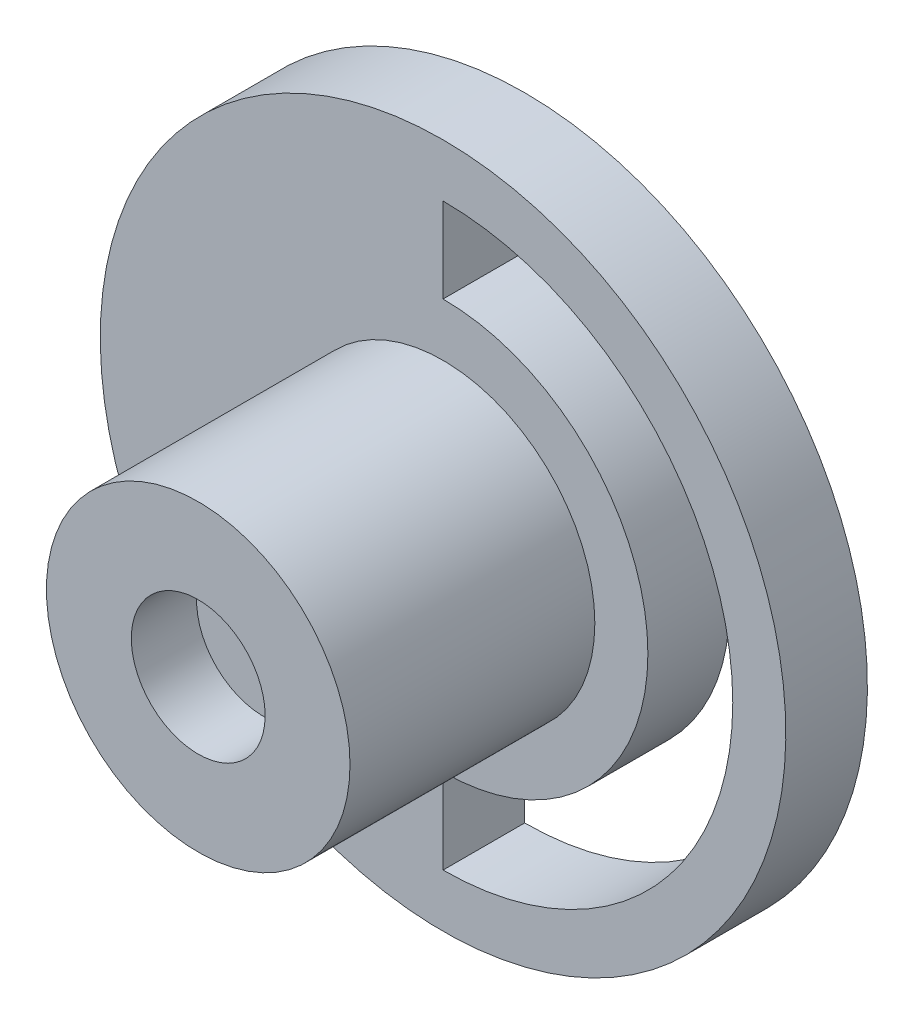
ISO-10303-21;
HEADER;
FILE_DESCRIPTION(('STEP AP214'),'2;1');
FILE_NAME('part.step','',(''),(''),'','','');
FILE_SCHEMA(('AUTOMOTIVE_DESIGN { 1 0 10303 214 1 1 1 1 }'));
ENDSEC;
DATA;
#1=APPLICATION_CONTEXT('core data for automotive mechanical design processes');
#2=APPLICATION_PROTOCOL_DEFINITION('international standard','automotive_design',2000,#1);
#3=PRODUCT_CONTEXT('',#1,'mechanical');
#4=PRODUCT('Part','Part','',(#3));
#5=PRODUCT_RELATED_PRODUCT_CATEGORY('part','',(#4));
#6=PRODUCT_DEFINITION_FORMATION('','',#4);
#7=PRODUCT_DEFINITION_CONTEXT('part definition',#1,'design');
#8=PRODUCT_DEFINITION('design','',#6,#7);
#9=PRODUCT_DEFINITION_SHAPE('','',#8);
#10=(LENGTH_UNIT() NAMED_UNIT(*) SI_UNIT(.MILLI.,.METRE.));
#11=(NAMED_UNIT(*) PLANE_ANGLE_UNIT() SI_UNIT($,.RADIAN.));
#12=(NAMED_UNIT(*) SI_UNIT($,.STERADIAN.) SOLID_ANGLE_UNIT());
#13=UNCERTAINTY_MEASURE_WITH_UNIT(LENGTH_MEASURE(1.E-05),#10,'distance_accuracy_value','');
#14=(GEOMETRIC_REPRESENTATION_CONTEXT(3) GLOBAL_UNCERTAINTY_ASSIGNED_CONTEXT((#13)) GLOBAL_UNIT_ASSIGNED_CONTEXT((#10,
#11,#12)) REPRESENTATION_CONTEXT('',''));
#15=CARTESIAN_POINT('',(0.,0.,0.));
#16=DIRECTION('',(0.,0.,1.));
#17=DIRECTION('',(1.,0.,0.));
#18=AXIS2_PLACEMENT_3D('',#15,#16,#17);
#19=CARTESIAN_POINT('',(0.,0.,10.));
#20=DIRECTION('',(0.,0.,-1.));
#21=DIRECTION('',(-1.,0.,0.));
#22=AXIS2_PLACEMENT_3D('',#19,#20,#21);
#23=CYLINDRICAL_SURFACE('',#22,4.65);
#24=CARTESIAN_POINT('',(0.,0.,2.5));
#25=DIRECTION('',(0.,0.,1.));
#26=DIRECTION('',(1.,0.,0.));
#27=AXIS2_PLACEMENT_3D('',#24,#25,#26);
#28=CIRCLE('',#27,4.65);
#29=CARTESIAN_POINT('',(4.65,0.,2.5));
#30=VERTEX_POINT('',#29);
#31=EDGE_CURVE('E11',#30,#30,#28,.F.);
#32=ORIENTED_EDGE('',*,*,#31,.F.);
#33=EDGE_LOOP('',(#32));
#34=FACE_BOUND('',#33,.T.);
#35=CARTESIAN_POINT('',(0.,0.,10.));
#36=DIRECTION('',(0.,0.,-1.));
#37=DIRECTION('',(1.,0.,0.));
#38=AXIS2_PLACEMENT_3D('',#35,#36,#37);
#39=CIRCLE('',#38,4.65);
#40=CARTESIAN_POINT('',(4.65,0.,10.));
#41=VERTEX_POINT('',#40);
#42=EDGE_CURVE('E25',#41,#41,#39,.T.);
#43=ORIENTED_EDGE('',*,*,#42,.T.);
#44=EDGE_LOOP('',(#43));
#45=FACE_BOUND('',#44,.T.);
#46=ADVANCED_FACE('F18',(#34,#45),#23,.T.);
#47=CARTESIAN_POINT('',(0.,0.,10.));
#48=DIRECTION('',(0.,0.,-1.));
#49=DIRECTION('',(-1.,0.,0.));
#50=AXIS2_PLACEMENT_3D('',#47,#48,#49);
#51=PLANE('',#50);
#52=CARTESIAN_POINT('',(0.,0.,10.));
#53=DIRECTION('',(0.,0.,-1.));
#54=DIRECTION('',(1.,0.,0.));
#55=AXIS2_PLACEMENT_3D('',#52,#53,#54);
#56=CIRCLE('',#55,2.05);
#57=CARTESIAN_POINT('',(2.05,0.,10.));
#58=VERTEX_POINT('',#57);
#59=EDGE_CURVE('E93',#58,#58,#56,.T.);
#60=ORIENTED_EDGE('',*,*,#59,.T.);
#61=EDGE_LOOP('',(#60));
#62=FACE_BOUND('',#61,.T.);
#63=ORIENTED_EDGE('',*,*,#42,.F.);
#64=EDGE_LOOP('',(#63));
#65=FACE_BOUND('',#64,.T.);
#66=ADVANCED_FACE('F106',(#62,#65),#51,.F.);
#67=CARTESIAN_POINT('',(0.,0.,8.));
#68=DIRECTION('',(0.,0.,1.));
#69=DIRECTION('',(1.,0.,0.));
#70=AXIS2_PLACEMENT_3D('',#67,#68,#69);
#71=CYLINDRICAL_SURFACE('',#70,2.05);
#72=CARTESIAN_POINT('',(0.,0.,8.));
#73=DIRECTION('',(0.,0.,-1.));
#74=DIRECTION('',(1.,0.,0.));
#75=AXIS2_PLACEMENT_3D('',#72,#73,#74);
#76=CIRCLE('',#75,2.05);
#77=CARTESIAN_POINT('',(2.05,0.,8.));
#78=VERTEX_POINT('',#77);
#79=EDGE_CURVE('E97',#78,#78,#76,.T.);
#80=ORIENTED_EDGE('',*,*,#79,.T.);
#81=EDGE_LOOP('',(#80));
#82=FACE_BOUND('',#81,.T.);
#83=ORIENTED_EDGE('',*,*,#59,.F.);
#84=EDGE_LOOP('',(#83));
#85=FACE_BOUND('',#84,.T.);
#86=ADVANCED_FACE('F108',(#82,#85),#71,.F.);
#87=CARTESIAN_POINT('',(0.,0.,8.));
#88=DIRECTION('',(0.,0.,-1.));
#89=DIRECTION('',(-1.,0.,0.));
#90=AXIS2_PLACEMENT_3D('',#87,#88,#89);
#91=PLANE('',#90);
#92=ORIENTED_EDGE('',*,*,#79,.F.);
#93=EDGE_LOOP('',(#92));
#94=FACE_BOUND('',#93,.T.);
#95=ADVANCED_FACE('F117',(#94),#91,.F.);
#96=CARTESIAN_POINT('',(0.,0.,2.5));
#97=DIRECTION('',(0.,0.,-1.));
#98=DIRECTION('',(-1.,0.,0.));
#99=AXIS2_PLACEMENT_3D('',#96,#97,#98);
#100=CYLINDRICAL_SURFACE('',#99,10.5);
#101=CARTESIAN_POINT('',(0.,0.,2.5));
#102=DIRECTION('',(0.,0.,1.));
#103=DIRECTION('',(0.,1.,0.));
#104=AXIS2_PLACEMENT_3D('',#101,#102,#103);
#105=CIRCLE('',#104,10.5);
#106=CARTESIAN_POINT('',(0.,10.5,2.5));
#107=VERTEX_POINT('',#106);
#108=EDGE_CURVE('E81',#107,#107,#105,.T.);
#109=ORIENTED_EDGE('',*,*,#108,.F.);
#110=EDGE_LOOP('',(#109));
#111=FACE_BOUND('',#110,.T.);
#112=CARTESIAN_POINT('',(0.,0.,0.));
#113=DIRECTION('',(0.,0.,1.));
#114=DIRECTION('',(0.,1.,0.));
#115=AXIS2_PLACEMENT_3D('',#112,#113,#114);
#116=CIRCLE('',#115,10.5);
#117=CARTESIAN_POINT('',(0.,10.5,0.));
#118=VERTEX_POINT('',#117);
#119=EDGE_CURVE('E76',#118,#118,#116,.T.);
#120=ORIENTED_EDGE('',*,*,#119,.T.);
#121=EDGE_LOOP('',(#120));
#122=FACE_BOUND('',#121,.T.);
#123=ADVANCED_FACE('F144',(#111,#122),#100,.T.);
#124=CARTESIAN_POINT('',(0.,0.,2.5));
#125=DIRECTION('',(0.,0.,1.));
#126=DIRECTION('',(1.,0.,0.));
#127=AXIS2_PLACEMENT_3D('',#124,#125,#126);
#128=PLANE('',#127);
#129=DIRECTION('',(0.,-1.,0.));
#130=VECTOR('',#129,1.);
#131=CARTESIAN_POINT('',(0.,-6.275,2.5));
#132=LINE('',#131,#130);
#133=CARTESIAN_POINT('',(0.,-6.275,2.5));
#134=VERTEX_POINT('',#133);
#135=CARTESIAN_POINT('',(0.,-8.875,2.5));
#136=VERTEX_POINT('',#135);
#137=EDGE_CURVE('E393',#134,#136,#132,.T.);
#138=ORIENTED_EDGE('',*,*,#137,.F.);
#139=CARTESIAN_POINT('',(0.,0.,2.5));
#140=DIRECTION('',(0.,0.,1.));
#141=DIRECTION('',(1.,0.,0.));
#142=AXIS2_PLACEMENT_3D('',#139,#140,#141);
#143=CIRCLE('',#142,6.275);
#144=CARTESIAN_POINT('',(0.,6.275,2.5));
#145=VERTEX_POINT('',#144);
#146=EDGE_CURVE('E83',#134,#145,#143,.T.);
#147=ORIENTED_EDGE('',*,*,#146,.T.);
#148=DIRECTION('',(0.,1.,0.));
#149=VECTOR('',#148,1.);
#150=CARTESIAN_POINT('',(0.,6.275,2.5));
#151=LINE('',#150,#149);
#152=CARTESIAN_POINT('',(0.,8.875,2.5));
#153=VERTEX_POINT('',#152);
#154=EDGE_CURVE('E394',#145,#153,#151,.T.);
#155=ORIENTED_EDGE('',*,*,#154,.T.);
#156=CARTESIAN_POINT('',(0.,0.,2.5));
#157=DIRECTION('',(0.,0.,1.));
#158=DIRECTION('',(1.,0.,0.));
#159=AXIS2_PLACEMENT_3D('',#156,#157,#158);
#160=CIRCLE('',#159,8.875);
#161=EDGE_CURVE('E60',#136,#153,#160,.T.);
#162=ORIENTED_EDGE('',*,*,#161,.F.);
#163=EDGE_LOOP('',(#138,#147,#155,#162));
#164=FACE_BOUND('',#163,.T.);
#165=ORIENTED_EDGE('',*,*,#31,.T.);
#166=EDGE_LOOP('',(#165));
#167=FACE_BOUND('',#166,.T.);
#168=ORIENTED_EDGE('',*,*,#108,.T.);
#169=EDGE_LOOP('',(#168));
#170=FACE_BOUND('',#169,.T.);
#171=ADVANCED_FACE('F138',(#164,#167,#170),#128,.T.);
#172=CARTESIAN_POINT('',(0.,0.,3.5));
#173=DIRECTION('',(0.,0.,1.));
#174=DIRECTION('',(1.,0.,0.));
#175=AXIS2_PLACEMENT_3D('',#172,#173,#174);
#176=PLANE('',#175);
#177=CARTESIAN_POINT('',(0.,0.,3.5));
#178=DIRECTION('',(0.,0.,1.));
#179=DIRECTION('',(1.,0.,0.));
#180=AXIS2_PLACEMENT_3D('',#177,#178,#179);
#181=CIRCLE('',#180,3.65);
#182=CARTESIAN_POINT('',(3.65,0.,3.5));
#183=VERTEX_POINT('',#182);
#184=EDGE_CURVE('E90',#183,#183,#181,.T.);
#185=ORIENTED_EDGE('',*,*,#184,.F.);
#186=EDGE_LOOP('',(#185));
#187=FACE_BOUND('',#186,.T.);
#188=ADVANCED_FACE('F131',(#187),#176,.F.);
#189=CARTESIAN_POINT('',(0.,0.,3.5));
#190=DIRECTION('',(0.,0.,-1.));
#191=DIRECTION('',(-1.,0.,0.));
#192=AXIS2_PLACEMENT_3D('',#189,#190,#191);
#193=CYLINDRICAL_SURFACE('',#192,3.65);
#194=ORIENTED_EDGE('',*,*,#184,.T.);
#195=EDGE_LOOP('',(#194));
#196=FACE_BOUND('',#195,.T.);
#197=CARTESIAN_POINT('',(0.,0.,0.));
#198=DIRECTION('',(0.,0.,1.));
#199=DIRECTION('',(1.,0.,0.));
#200=AXIS2_PLACEMENT_3D('',#197,#198,#199);
#201=CIRCLE('',#200,3.65);
#202=CARTESIAN_POINT('',(3.65,0.,0.));
#203=VERTEX_POINT('',#202);
#204=EDGE_CURVE('E88',#203,#203,#201,.T.);
#205=ORIENTED_EDGE('',*,*,#204,.F.);
#206=EDGE_LOOP('',(#205));
#207=FACE_BOUND('',#206,.T.);
#208=ADVANCED_FACE('F123',(#196,#207),#193,.F.);
#209=CARTESIAN_POINT('',(0.,0.,0.));
#210=DIRECTION('',(0.,0.,-1.));
#211=DIRECTION('',(-1.,0.,0.));
#212=AXIS2_PLACEMENT_3D('',#209,#210,#211);
#213=PLANE('',#212);
#214=DIRECTION('',(0.,1.,0.));
#215=VECTOR('',#214,1.);
#216=CARTESIAN_POINT('',(0.,-8.875,0.));
#217=LINE('',#216,#215);
#218=CARTESIAN_POINT('',(0.,-8.875,0.));
#219=VERTEX_POINT('',#218);
#220=CARTESIAN_POINT('',(0.,-6.275,0.));
#221=VERTEX_POINT('',#220);
#222=EDGE_CURVE('E75',#219,#221,#217,.T.);
#223=ORIENTED_EDGE('',*,*,#222,.F.);
#224=CARTESIAN_POINT('',(0.,0.,0.));
#225=DIRECTION('',(0.,0.,1.));
#226=DIRECTION('',(1.,0.,0.));
#227=AXIS2_PLACEMENT_3D('',#224,#225,#226);
#228=CIRCLE('',#227,8.875);
#229=CARTESIAN_POINT('',(0.,8.875,0.));
#230=VERTEX_POINT('',#229);
#231=EDGE_CURVE('E57',#219,#230,#228,.T.);
#232=ORIENTED_EDGE('',*,*,#231,.T.);
#233=DIRECTION('',(0.,-1.,0.));
#234=VECTOR('',#233,1.);
#235=CARTESIAN_POINT('',(0.,8.875,0.));
#236=LINE('',#235,#234);
#237=CARTESIAN_POINT('',(0.,6.275,0.));
#238=VERTEX_POINT('',#237);
#239=EDGE_CURVE('E63',#230,#238,#236,.T.);
#240=ORIENTED_EDGE('',*,*,#239,.T.);
#241=CARTESIAN_POINT('',(0.,0.,0.));
#242=DIRECTION('',(0.,0.,1.));
#243=DIRECTION('',(1.,0.,0.));
#244=AXIS2_PLACEMENT_3D('',#241,#242,#243);
#245=CIRCLE('',#244,6.275);
#246=EDGE_CURVE('E77',#221,#238,#245,.T.);
#247=ORIENTED_EDGE('',*,*,#246,.F.);
#248=EDGE_LOOP('',(#223,#232,#240,#247));
#249=FACE_BOUND('',#248,.T.);
#250=ORIENTED_EDGE('',*,*,#204,.T.);
#251=EDGE_LOOP('',(#250));
#252=FACE_BOUND('',#251,.T.);
#253=ORIENTED_EDGE('',*,*,#119,.F.);
#254=EDGE_LOOP('',(#253));
#255=FACE_BOUND('',#254,.T.);
#256=ADVANCED_FACE('F72',(#249,#252,#255),#213,.T.);
#257=CARTESIAN_POINT('',(0.,0.,0.));
#258=DIRECTION('',(0.,0.,1.));
#259=DIRECTION('',(1.,0.,0.));
#260=AXIS2_PLACEMENT_3D('',#257,#258,#259);
#261=CYLINDRICAL_SURFACE('',#260,8.875);
#262=ORIENTED_EDGE('',*,*,#231,.F.);
#263=DIRECTION('',(0.,0.,-1.));
#264=VECTOR('',#263,1.);
#265=CARTESIAN_POINT('',(0.,-8.875,2.5));
#266=LINE('',#265,#264);
#267=EDGE_CURVE('E390',#136,#219,#266,.T.);
#268=ORIENTED_EDGE('',*,*,#267,.F.);
#269=ORIENTED_EDGE('',*,*,#161,.T.);
#270=DIRECTION('',(0.,0.,-1.));
#271=VECTOR('',#270,1.);
#272=CARTESIAN_POINT('',(0.,8.875,2.5));
#273=LINE('',#272,#271);
#274=EDGE_CURVE('E32',#153,#230,#273,.T.);
#275=ORIENTED_EDGE('',*,*,#274,.T.);
#276=EDGE_LOOP('',(#262,#268,#269,#275));
#277=FACE_BOUND('',#276,.T.);
#278=ADVANCED_FACE('F55',(#277),#261,.F.);
#279=CARTESIAN_POINT('',(0.,0.,0.));
#280=DIRECTION('',(0.,0.,1.));
#281=DIRECTION('',(1.,0.,0.));
#282=AXIS2_PLACEMENT_3D('',#279,#280,#281);
#283=CYLINDRICAL_SURFACE('',#282,6.275);
#284=ORIENTED_EDGE('',*,*,#146,.F.);
#285=DIRECTION('',(0.,0.,1.));
#286=VECTOR('',#285,1.);
#287=CARTESIAN_POINT('',(0.,-6.275,0.));
#288=LINE('',#287,#286);
#289=EDGE_CURVE('E396',#221,#134,#288,.T.);
#290=ORIENTED_EDGE('',*,*,#289,.F.);
#291=ORIENTED_EDGE('',*,*,#246,.T.);
#292=DIRECTION('',(0.,0.,1.));
#293=VECTOR('',#292,1.);
#294=CARTESIAN_POINT('',(0.,6.275,0.));
#295=LINE('',#294,#293);
#296=EDGE_CURVE('E37',#238,#145,#295,.T.);
#297=ORIENTED_EDGE('',*,*,#296,.T.);
#298=EDGE_LOOP('',(#284,#290,#291,#297));
#299=FACE_BOUND('',#298,.T.);
#300=ADVANCED_FACE('F129',(#299),#283,.T.);
#301=CARTESIAN_POINT('',(0.,0.,0.));
#302=DIRECTION('',(1.,0.,0.));
#303=DIRECTION('',(0.,0.,1.));
#304=AXIS2_PLACEMENT_3D('',#301,#302,#303);
#305=PLANE('',#304);
#306=ORIENTED_EDGE('',*,*,#267,.T.);
#307=ORIENTED_EDGE('',*,*,#222,.T.);
#308=ORIENTED_EDGE('',*,*,#289,.T.);
#309=ORIENTED_EDGE('',*,*,#137,.T.);
#310=EDGE_LOOP('',(#306,#307,#308,#309));
#311=FACE_BOUND('',#310,.T.);
#312=ADVANCED_FACE('F164',(#311),#305,.T.);
#313=CARTESIAN_POINT('',(0.,0.,0.));
#314=DIRECTION('',(-1.,0.,0.));
#315=DIRECTION('',(0.,0.,1.));
#316=AXIS2_PLACEMENT_3D('',#313,#314,#315);
#317=PLANE('',#316);
#318=ORIENTED_EDGE('',*,*,#274,.F.);
#319=ORIENTED_EDGE('',*,*,#154,.F.);
#320=ORIENTED_EDGE('',*,*,#296,.F.);
#321=ORIENTED_EDGE('',*,*,#239,.F.);
#322=EDGE_LOOP('',(#318,#319,#320,#321));
#323=FACE_BOUND('',#322,.T.);
#324=ADVANCED_FACE('F66',(#323),#317,.F.);
#325=CLOSED_SHELL('',(#46,#66,#86,#95,#123,#171,#188,#208,#256,#278,#300,#312,#324));
#326=MANIFOLD_SOLID_BREP('B1',#325);
#327=ADVANCED_BREP_SHAPE_REPRESENTATION('',(#18,#326),#14);
#328=SHAPE_DEFINITION_REPRESENTATION(#9,#327);
ENDSEC;
END-ISO-10303-21;
